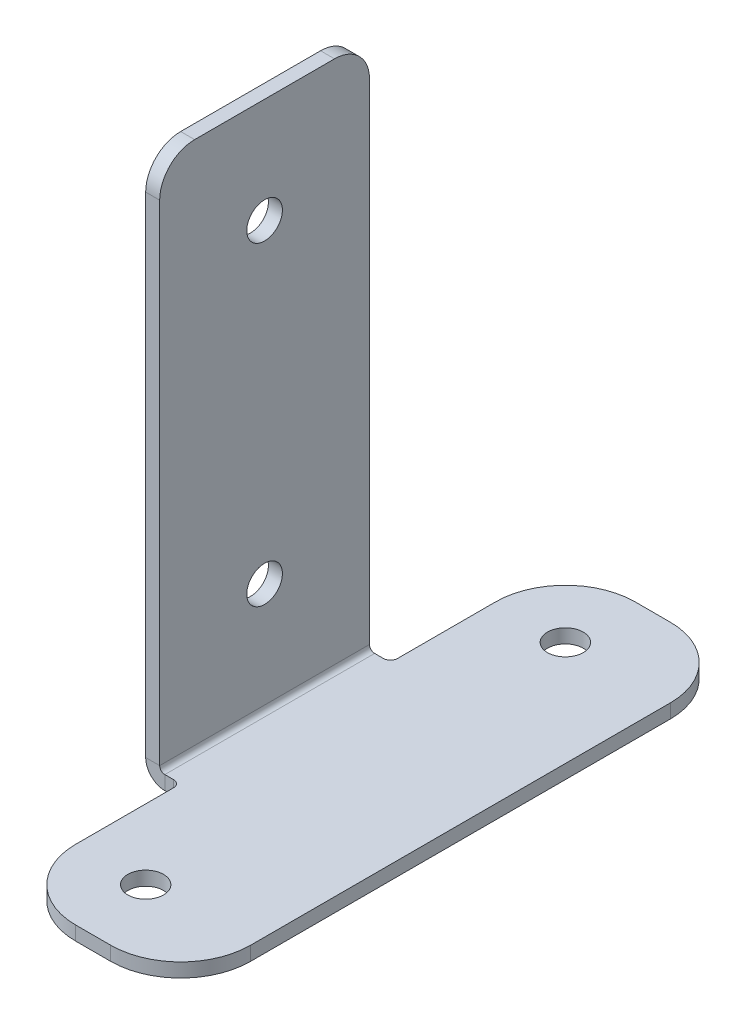
ISO-10303-21;
HEADER;
FILE_DESCRIPTION(('STEP AP214'),'2;1');
FILE_NAME('part.step','',(''),(''),'','','');
FILE_SCHEMA(('AUTOMOTIVE_DESIGN { 1 0 10303 214 1 1 1 1 }'));
ENDSEC;
DATA;
#1=APPLICATION_CONTEXT('core data for automotive mechanical design processes');
#2=APPLICATION_PROTOCOL_DEFINITION('international standard','automotive_design',2000,#1);
#3=PRODUCT_CONTEXT('',#1,'mechanical');
#4=PRODUCT('Part','Part','',(#3));
#5=PRODUCT_RELATED_PRODUCT_CATEGORY('part','',(#4));
#6=PRODUCT_DEFINITION_FORMATION('','',#4);
#7=PRODUCT_DEFINITION_CONTEXT('part definition',#1,'design');
#8=PRODUCT_DEFINITION('design','',#6,#7);
#9=PRODUCT_DEFINITION_SHAPE('','',#8);
#10=(LENGTH_UNIT() NAMED_UNIT(*) SI_UNIT(.MILLI.,.METRE.));
#11=(NAMED_UNIT(*) PLANE_ANGLE_UNIT() SI_UNIT($,.RADIAN.));
#12=(NAMED_UNIT(*) SI_UNIT($,.STERADIAN.) SOLID_ANGLE_UNIT());
#13=UNCERTAINTY_MEASURE_WITH_UNIT(LENGTH_MEASURE(1.E-05),#10,'distance_accuracy_value','');
#14=(GEOMETRIC_REPRESENTATION_CONTEXT(3) GLOBAL_UNCERTAINTY_ASSIGNED_CONTEXT((#13)) GLOBAL_UNIT_ASSIGNED_CONTEXT((#10,
#11,#12)) REPRESENTATION_CONTEXT('',''));
#15=CARTESIAN_POINT('',(0.,0.,0.));
#16=DIRECTION('',(0.,0.,1.));
#17=DIRECTION('',(1.,0.,0.));
#18=AXIS2_PLACEMENT_3D('',#15,#16,#17);
#19=CARTESIAN_POINT('',(-15.,-3.254644901112,15.));
#20=DIRECTION('',(0.,0.,1.));
#21=DIRECTION('',(0.,-1.,0.));
#22=AXIS2_PLACEMENT_3D('',#19,#20,#21);
#23=PLANE('',#22);
#24=DIRECTION('',(0.,-1.,0.));
#25=VECTOR('',#24,1.);
#26=CARTESIAN_POINT('',(-14.9999999999998,70.745355098888,15.));
#27=LINE('',#26,#25);
#28=CARTESIAN_POINT('',(-14.9999999999998,70.745355098888,15.));
#29=VERTEX_POINT('',#28);
#30=CARTESIAN_POINT('',(-15.,0.736600000000007,15.));
#31=VERTEX_POINT('',#30);
#32=EDGE_CURVE('E213',#29,#31,#27,.T.);
#33=ORIENTED_EDGE('',*,*,#32,.T.);
#34=DIRECTION('',(1.,0.,0.));
#35=VECTOR('',#34,1.);
#36=CARTESIAN_POINT('',(-15.,0.736600000000009,15.));
#37=LINE('',#36,#35);
#38=CARTESIAN_POINT('',(-13.,0.736600000000002,15.));
#39=VERTEX_POINT('',#38);
#40=EDGE_CURVE('E12',#31,#39,#37,.T.);
#41=ORIENTED_EDGE('',*,*,#40,.T.);
#42=DIRECTION('',(0.,-1.,0.));
#43=VECTOR('',#42,1.);
#44=CARTESIAN_POINT('',(-13.,-3.25464490111201,15.));
#45=LINE('',#44,#43);
#46=CARTESIAN_POINT('',(-12.9999999999998,70.745355098888,15.));
#47=VERTEX_POINT('',#46);
#48=EDGE_CURVE('E82',#47,#39,#45,.T.);
#49=ORIENTED_EDGE('',*,*,#48,.F.);
#50=DIRECTION('',(1.,0.,0.));
#51=VECTOR('',#50,1.);
#52=CARTESIAN_POINT('',(-14.9999999999998,70.745355098888,15.));
#53=LINE('',#52,#51);
#54=EDGE_CURVE('E63',#29,#47,#53,.T.);
#55=ORIENTED_EDGE('',*,*,#54,.F.);
#56=EDGE_LOOP('',(#33,#41,#49,#55));
#57=FACE_BOUND('',#56,.T.);
#58=ADVANCED_FACE('F38',(#57),#23,.T.);
#59=CARTESIAN_POINT('',(-15.,5.74535509888801,-15.));
#60=DIRECTION('',(0.,0.,-1.));
#61=DIRECTION('',(0.,1.,0.));
#62=AXIS2_PLACEMENT_3D('',#59,#60,#61);
#63=PLANE('',#62);
#64=DIRECTION('',(0.,1.,0.));
#65=VECTOR('',#64,1.);
#66=CARTESIAN_POINT('',(-13.,5.74535509888801,-15.));
#67=LINE('',#66,#65);
#68=CARTESIAN_POINT('',(-13.,0.736600000000003,-15.));
#69=VERTEX_POINT('',#68);
#70=CARTESIAN_POINT('',(-12.9999999999998,70.745355098888,-15.));
#71=VERTEX_POINT('',#70);
#72=EDGE_CURVE('E207',#69,#71,#67,.T.);
#73=ORIENTED_EDGE('',*,*,#72,.F.);
#74=DIRECTION('',(-1.,0.,0.));
#75=VECTOR('',#74,1.);
#76=CARTESIAN_POINT('',(-15.,0.736600000000009,-15.));
#77=LINE('',#76,#75);
#78=CARTESIAN_POINT('',(-15.,0.73660000000001,-15.));
#79=VERTEX_POINT('',#78);
#80=EDGE_CURVE('E189',#69,#79,#77,.T.);
#81=ORIENTED_EDGE('',*,*,#80,.T.);
#82=DIRECTION('',(0.,1.,0.));
#83=VECTOR('',#82,1.);
#84=CARTESIAN_POINT('',(-15.,5.74535509888801,-15.));
#85=LINE('',#84,#83);
#86=CARTESIAN_POINT('',(-14.9999999999998,70.745355098888,-15.));
#87=VERTEX_POINT('',#86);
#88=EDGE_CURVE('E41',#79,#87,#85,.T.);
#89=ORIENTED_EDGE('',*,*,#88,.T.);
#90=DIRECTION('',(1.,0.,0.));
#91=VECTOR('',#90,1.);
#92=CARTESIAN_POINT('',(-14.9999999999998,70.745355098888,-15.));
#93=LINE('',#92,#91);
#94=EDGE_CURVE('E215',#87,#71,#93,.T.);
#95=ORIENTED_EDGE('',*,*,#94,.T.);
#96=EDGE_LOOP('',(#73,#81,#89,#95));
#97=FACE_BOUND('',#96,.T.);
#98=ADVANCED_FACE('F206',(#97),#63,.T.);
#99=CARTESIAN_POINT('',(-15.,-14.254644901112,30.));
#100=DIRECTION('',(-1.,0.,0.));
#101=DIRECTION('',(0.,0.,-1.));
#102=AXIS2_PLACEMENT_3D('',#99,#100,#101);
#103=PLANE('',#102);
#104=CARTESIAN_POINT('',(-14.9999999999999,15.745355098888,0.));
#105=DIRECTION('',(1.,0.,0.));
#106=DIRECTION('',(0.,0.,1.));
#107=AXIS2_PLACEMENT_3D('',#104,#105,#106);
#108=CIRCLE('',#107,2.54999999999999);
#109=CARTESIAN_POINT('',(-14.9999999999999,15.745355098888,2.54999999999999));
#110=VERTEX_POINT('',#109);
#111=EDGE_CURVE('E230',#110,#110,#108,.T.);
#112=ORIENTED_EDGE('',*,*,#111,.T.);
#113=EDGE_LOOP('',(#112));
#114=FACE_BOUND('',#113,.T.);
#115=CARTESIAN_POINT('',(-14.9999999999998,60.745355098888,0.));
#116=DIRECTION('',(1.,0.,0.));
#117=DIRECTION('',(0.,0.,1.));
#118=AXIS2_PLACEMENT_3D('',#115,#116,#117);
#119=CIRCLE('',#118,2.54999999999999);
#120=CARTESIAN_POINT('',(-14.9999999999998,60.745355098888,2.54999999999999));
#121=VERTEX_POINT('',#120);
#122=EDGE_CURVE('E219',#121,#121,#119,.T.);
#123=ORIENTED_EDGE('',*,*,#122,.T.);
#124=EDGE_LOOP('',(#123));
#125=FACE_BOUND('',#124,.T.);
#126=ORIENTED_EDGE('',*,*,#88,.F.);
#127=DIRECTION('',(0.,0.,1.));
#128=VECTOR('',#127,1.);
#129=CARTESIAN_POINT('',(-15.,0.736600000000009,30.));
#130=LINE('',#129,#128);
#131=EDGE_CURVE('E184',#79,#31,#130,.T.);
#132=ORIENTED_EDGE('',*,*,#131,.T.);
#133=ORIENTED_EDGE('',*,*,#32,.F.);
#134=CARTESIAN_POINT('',(-14.9999999999998,70.745355098888,9.99999999999999));
#135=DIRECTION('',(1.,0.,0.));
#136=DIRECTION('',(0.,0.,1.));
#137=AXIS2_PLACEMENT_3D('',#134,#135,#136);
#138=CIRCLE('',#137,5.);
#139=CARTESIAN_POINT('',(-14.9999999999997,75.745355098888,9.99999999999999));
#140=VERTEX_POINT('',#139);
#141=EDGE_CURVE('E216',#140,#29,#138,.T.);
#142=ORIENTED_EDGE('',*,*,#141,.F.);
#143=DIRECTION('',(0.,0.,1.));
#144=VECTOR('',#143,1.);
#145=CARTESIAN_POINT('',(-14.9999999999997,75.745355098888,-9.99999999999999));
#146=LINE('',#145,#144);
#147=CARTESIAN_POINT('',(-14.9999999999997,75.745355098888,-9.99999999999999));
#148=VERTEX_POINT('',#147);
#149=EDGE_CURVE('E237',#148,#140,#146,.T.);
#150=ORIENTED_EDGE('',*,*,#149,.F.);
#151=CARTESIAN_POINT('',(-14.9999999999998,70.745355098888,-9.99999999999999));
#152=DIRECTION('',(1.,0.,0.));
#153=DIRECTION('',(0.,0.,1.));
#154=AXIS2_PLACEMENT_3D('',#151,#152,#153);
#155=CIRCLE('',#154,5.00000000000001);
#156=EDGE_CURVE('E204',#87,#148,#155,.T.);
#157=ORIENTED_EDGE('',*,*,#156,.F.);
#158=EDGE_LOOP('',(#126,#132,#133,#142,#150,#157));
#159=FACE_BOUND('',#158,.T.);
#160=ADVANCED_FACE('F201',(#114,#125,#159),#103,.T.);
#161=CARTESIAN_POINT('',(-14.9999999999998,70.745355098888,9.99999999999999));
#162=DIRECTION('',(1.,0.,0.));
#163=DIRECTION('',(0.,0.,1.));
#164=AXIS2_PLACEMENT_3D('',#161,#162,#163);
#165=CYLINDRICAL_SURFACE('',#164,5.);
#166=CARTESIAN_POINT('',(-12.9999999999998,70.745355098888,9.99999999999999));
#167=DIRECTION('',(1.,0.,0.));
#168=DIRECTION('',(0.,0.,1.));
#169=AXIS2_PLACEMENT_3D('',#166,#167,#168);
#170=CIRCLE('',#169,5.);
#171=CARTESIAN_POINT('',(-12.9999999999997,75.745355098888,9.99999999999999));
#172=VERTEX_POINT('',#171);
#173=EDGE_CURVE('E217',#172,#47,#170,.T.);
#174=ORIENTED_EDGE('',*,*,#173,.F.);
#175=DIRECTION('',(1.,0.,0.));
#176=VECTOR('',#175,1.);
#177=CARTESIAN_POINT('',(-14.9999999999997,75.745355098888,9.99999999999999));
#178=LINE('',#177,#176);
#179=EDGE_CURVE('E247',#140,#172,#178,.T.);
#180=ORIENTED_EDGE('',*,*,#179,.F.);
#181=ORIENTED_EDGE('',*,*,#141,.T.);
#182=ORIENTED_EDGE('',*,*,#54,.T.);
#183=EDGE_LOOP('',(#174,#180,#181,#182));
#184=FACE_BOUND('',#183,.T.);
#185=ADVANCED_FACE('F261',(#184),#165,.T.);
#186=CARTESIAN_POINT('',(-14.9999999999997,75.745355098888,-9.99999999999999));
#187=DIRECTION('',(0.,1.,0.));
#188=DIRECTION('',(0.,0.,1.));
#189=AXIS2_PLACEMENT_3D('',#186,#187,#188);
#190=PLANE('',#189);
#191=DIRECTION('',(0.,0.,1.));
#192=VECTOR('',#191,1.);
#193=CARTESIAN_POINT('',(-12.9999999999997,75.745355098888,-9.99999999999999));
#194=LINE('',#193,#192);
#195=CARTESIAN_POINT('',(-12.9999999999997,75.745355098888,-9.99999999999999));
#196=VERTEX_POINT('',#195);
#197=EDGE_CURVE('E222',#196,#172,#194,.T.);
#198=ORIENTED_EDGE('',*,*,#197,.F.);
#199=DIRECTION('',(1.,0.,0.));
#200=VECTOR('',#199,1.);
#201=CARTESIAN_POINT('',(-14.9999999999997,75.745355098888,-9.99999999999999));
#202=LINE('',#201,#200);
#203=EDGE_CURVE('E249',#148,#196,#202,.T.);
#204=ORIENTED_EDGE('',*,*,#203,.F.);
#205=ORIENTED_EDGE('',*,*,#149,.T.);
#206=ORIENTED_EDGE('',*,*,#179,.T.);
#207=EDGE_LOOP('',(#198,#204,#205,#206));
#208=FACE_BOUND('',#207,.T.);
#209=ADVANCED_FACE('F258',(#208),#190,.T.);
#210=CARTESIAN_POINT('',(-14.9999999999998,70.745355098888,-9.99999999999999));
#211=DIRECTION('',(1.,0.,0.));
#212=DIRECTION('',(0.,0.,1.));
#213=AXIS2_PLACEMENT_3D('',#210,#211,#212);
#214=CYLINDRICAL_SURFACE('',#213,5.00000000000001);
#215=CARTESIAN_POINT('',(-12.9999999999998,70.745355098888,-9.99999999999999));
#216=DIRECTION('',(1.,0.,0.));
#217=DIRECTION('',(0.,0.,1.));
#218=AXIS2_PLACEMENT_3D('',#215,#216,#217);
#219=CIRCLE('',#218,5.00000000000001);
#220=EDGE_CURVE('E218',#71,#196,#219,.T.);
#221=ORIENTED_EDGE('',*,*,#220,.F.);
#222=ORIENTED_EDGE('',*,*,#94,.F.);
#223=ORIENTED_EDGE('',*,*,#156,.T.);
#224=ORIENTED_EDGE('',*,*,#203,.T.);
#225=EDGE_LOOP('',(#221,#222,#223,#224));
#226=FACE_BOUND('',#225,.T.);
#227=ADVANCED_FACE('F252',(#226),#214,.T.);
#228=CARTESIAN_POINT('',(-13.,-14.254644901112,30.));
#229=DIRECTION('',(-1.,0.,0.));
#230=DIRECTION('',(0.,0.,-1.));
#231=AXIS2_PLACEMENT_3D('',#228,#229,#230);
#232=PLANE('',#231);
#233=DIRECTION('',(0.,0.,1.));
#234=VECTOR('',#233,1.);
#235=CARTESIAN_POINT('',(-13.,0.736600000000002,30.));
#236=LINE('',#235,#234);
#237=EDGE_CURVE('E46',#69,#39,#236,.T.);
#238=ORIENTED_EDGE('',*,*,#237,.F.);
#239=ORIENTED_EDGE('',*,*,#72,.T.);
#240=ORIENTED_EDGE('',*,*,#220,.T.);
#241=ORIENTED_EDGE('',*,*,#197,.T.);
#242=ORIENTED_EDGE('',*,*,#173,.T.);
#243=ORIENTED_EDGE('',*,*,#48,.T.);
#244=EDGE_LOOP('',(#238,#239,#240,#241,#242,#243));
#245=FACE_BOUND('',#244,.T.);
#246=CARTESIAN_POINT('',(-12.9999999999999,15.745355098888,0.));
#247=DIRECTION('',(1.,0.,0.));
#248=DIRECTION('',(0.,0.,1.));
#249=AXIS2_PLACEMENT_3D('',#246,#247,#248);
#250=CIRCLE('',#249,2.54999999999999);
#251=CARTESIAN_POINT('',(-12.9999999999999,15.745355098888,2.54999999999999));
#252=VERTEX_POINT('',#251);
#253=EDGE_CURVE('E233',#252,#252,#250,.T.);
#254=ORIENTED_EDGE('',*,*,#253,.F.);
#255=EDGE_LOOP('',(#254));
#256=FACE_BOUND('',#255,.T.);
#257=CARTESIAN_POINT('',(-12.9999999999998,60.745355098888,0.));
#258=DIRECTION('',(1.,0.,0.));
#259=DIRECTION('',(0.,0.,1.));
#260=AXIS2_PLACEMENT_3D('',#257,#258,#259);
#261=CIRCLE('',#260,2.54999999999999);
#262=CARTESIAN_POINT('',(-12.9999999999998,60.745355098888,2.54999999999999));
#263=VERTEX_POINT('',#262);
#264=EDGE_CURVE('E225',#263,#263,#261,.T.);
#265=ORIENTED_EDGE('',*,*,#264,.F.);
#266=EDGE_LOOP('',(#265));
#267=FACE_BOUND('',#266,.T.);
#268=ADVANCED_FACE('F254',(#245,#256,#267),#232,.F.);
#269=CARTESIAN_POINT('',(-14.9999999999998,60.745355098888,0.));
#270=DIRECTION('',(1.,0.,0.));
#271=DIRECTION('',(0.,0.,1.));
#272=AXIS2_PLACEMENT_3D('',#269,#270,#271);
#273=CYLINDRICAL_SURFACE('',#272,2.54999999999999);
#274=ORIENTED_EDGE('',*,*,#122,.F.);
#275=EDGE_LOOP('',(#274));
#276=FACE_BOUND('',#275,.T.);
#277=ORIENTED_EDGE('',*,*,#264,.T.);
#278=EDGE_LOOP('',(#277));
#279=FACE_BOUND('',#278,.T.);
#280=ADVANCED_FACE('F404',(#276,#279),#273,.F.);
#281=CARTESIAN_POINT('',(-14.9999999999999,15.745355098888,0.));
#282=DIRECTION('',(1.,0.,0.));
#283=DIRECTION('',(0.,0.,1.));
#284=AXIS2_PLACEMENT_3D('',#281,#282,#283);
#285=CYLINDRICAL_SURFACE('',#284,2.54999999999999);
#286=ORIENTED_EDGE('',*,*,#111,.F.);
#287=EDGE_LOOP('',(#286));
#288=FACE_BOUND('',#287,.T.);
#289=ORIENTED_EDGE('',*,*,#253,.T.);
#290=EDGE_LOOP('',(#289));
#291=FACE_BOUND('',#290,.T.);
#292=ADVANCED_FACE('F401',(#288,#291),#285,.F.);
#293=CARTESIAN_POINT('',(0.,-2.,30.));
#294=DIRECTION('',(0.,1.,0.));
#295=DIRECTION('',(0.,0.,1.));
#296=AXIS2_PLACEMENT_3D('',#293,#294,#295);
#297=CYLINDRICAL_SURFACE('',#296,2.55);
#298=CARTESIAN_POINT('',(0.,-2.,30.));
#299=DIRECTION('',(0.,1.,0.));
#300=DIRECTION('',(0.,0.,-1.));
#301=AXIS2_PLACEMENT_3D('',#298,#299,#300);
#302=CIRCLE('',#301,2.55);
#303=CARTESIAN_POINT('',(0.,-2.,27.45));
#304=VERTEX_POINT('',#303);
#305=EDGE_CURVE('E324',#304,#304,#302,.T.);
#306=ORIENTED_EDGE('',*,*,#305,.F.);
#307=EDGE_LOOP('',(#306));
#308=FACE_BOUND('',#307,.T.);
#309=CARTESIAN_POINT('',(0.,0.,30.));
#310=DIRECTION('',(0.,1.,0.));
#311=DIRECTION('',(0.,0.,-1.));
#312=AXIS2_PLACEMENT_3D('',#309,#310,#311);
#313=CIRCLE('',#312,2.55);
#314=CARTESIAN_POINT('',(0.,0.,27.45));
#315=VERTEX_POINT('',#314);
#316=EDGE_CURVE('E389',#315,#315,#313,.T.);
#317=ORIENTED_EDGE('',*,*,#316,.T.);
#318=EDGE_LOOP('',(#317));
#319=FACE_BOUND('',#318,.T.);
#320=ADVANCED_FACE('F413',(#308,#319),#297,.F.);
#321=CARTESIAN_POINT('',(0.,-2.,-30.));
#322=DIRECTION('',(0.,1.,0.));
#323=DIRECTION('',(0.,0.,1.));
#324=AXIS2_PLACEMENT_3D('',#321,#322,#323);
#325=CYLINDRICAL_SURFACE('',#324,2.55);
#326=CARTESIAN_POINT('',(0.,-2.,-30.));
#327=DIRECTION('',(0.,1.,0.));
#328=DIRECTION('',(0.,0.,1.));
#329=AXIS2_PLACEMENT_3D('',#326,#327,#328);
#330=CIRCLE('',#329,2.55);
#331=CARTESIAN_POINT('',(0.,-2.,-27.45));
#332=VERTEX_POINT('',#331);
#333=EDGE_CURVE('E327',#332,#332,#330,.T.);
#334=ORIENTED_EDGE('',*,*,#333,.F.);
#335=EDGE_LOOP('',(#334));
#336=FACE_BOUND('',#335,.T.);
#337=CARTESIAN_POINT('',(0.,0.,-30.));
#338=DIRECTION('',(0.,1.,0.));
#339=DIRECTION('',(0.,0.,1.));
#340=AXIS2_PLACEMENT_3D('',#337,#338,#339);
#341=CIRCLE('',#340,2.55);
#342=CARTESIAN_POINT('',(0.,0.,-27.45));
#343=VERTEX_POINT('',#342);
#344=EDGE_CURVE('E386',#343,#343,#341,.T.);
#345=ORIENTED_EDGE('',*,*,#344,.T.);
#346=EDGE_LOOP('',(#345));
#347=FACE_BOUND('',#346,.T.);
#348=ADVANCED_FACE('F472',(#336,#347),#325,.F.);
#349=CARTESIAN_POINT('',(-11.,-2.,16.));
#350=DIRECTION('',(0.,1.,0.));
#351=DIRECTION('',(0.,0.,1.));
#352=AXIS2_PLACEMENT_3D('',#349,#350,#351);
#353=CYLINDRICAL_SURFACE('',#352,1.);
#354=CARTESIAN_POINT('',(-11.,0.,16.));
#355=DIRECTION('',(0.,-1.,0.));
#356=DIRECTION('',(0.,0.,-1.));
#357=AXIS2_PLACEMENT_3D('',#354,#355,#356);
#358=CIRCLE('',#357,1.);
#359=CARTESIAN_POINT('',(-11.,0.,15.));
#360=VERTEX_POINT('',#359);
#361=CARTESIAN_POINT('',(-10.,0.,16.));
#362=VERTEX_POINT('',#361);
#363=EDGE_CURVE('E314',#360,#362,#358,.T.);
#364=ORIENTED_EDGE('',*,*,#363,.F.);
#365=DIRECTION('',(0.,1.,0.));
#366=VECTOR('',#365,1.);
#367=CARTESIAN_POINT('',(-11.,-2.,15.));
#368=LINE('',#367,#366);
#369=CARTESIAN_POINT('',(-11.,-2.,15.));
#370=VERTEX_POINT('',#369);
#371=EDGE_CURVE('E279',#370,#360,#368,.T.);
#372=ORIENTED_EDGE('',*,*,#371,.F.);
#373=CARTESIAN_POINT('',(-11.,-2.,16.));
#374=DIRECTION('',(0.,-1.,0.));
#375=DIRECTION('',(0.,0.,-1.));
#376=AXIS2_PLACEMENT_3D('',#373,#374,#375);
#377=CIRCLE('',#376,1.);
#378=CARTESIAN_POINT('',(-10.,-2.,16.));
#379=VERTEX_POINT('',#378);
#380=EDGE_CURVE('E383',#370,#379,#377,.T.);
#381=ORIENTED_EDGE('',*,*,#380,.T.);
#382=DIRECTION('',(0.,1.,0.));
#383=VECTOR('',#382,1.);
#384=CARTESIAN_POINT('',(-10.,-2.,16.));
#385=LINE('',#384,#383);
#386=EDGE_CURVE('E381',#379,#362,#385,.T.);
#387=ORIENTED_EDGE('',*,*,#386,.T.);
#388=EDGE_LOOP('',(#364,#372,#381,#387));
#389=FACE_BOUND('',#388,.T.);
#390=ADVANCED_FACE('F484',(#389),#353,.F.);
#391=CARTESIAN_POINT('',(-10.,-2.,16.));
#392=DIRECTION('',(-1.,0.,0.));
#393=DIRECTION('',(0.,0.,1.));
#394=AXIS2_PLACEMENT_3D('',#391,#392,#393);
#395=PLANE('',#394);
#396=DIRECTION('',(0.,0.,1.));
#397=VECTOR('',#396,1.);
#398=CARTESIAN_POINT('',(-10.,0.,16.));
#399=LINE('',#398,#397);
#400=CARTESIAN_POINT('',(-10.,0.,30.));
#401=VERTEX_POINT('',#400);
#402=EDGE_CURVE('E311',#362,#401,#399,.T.);
#403=ORIENTED_EDGE('',*,*,#402,.F.);
#404=ORIENTED_EDGE('',*,*,#386,.F.);
#405=DIRECTION('',(0.,0.,1.));
#406=VECTOR('',#405,1.);
#407=CARTESIAN_POINT('',(-10.,-2.,16.));
#408=LINE('',#407,#406);
#409=CARTESIAN_POINT('',(-10.,-2.,30.));
#410=VERTEX_POINT('',#409);
#411=EDGE_CURVE('E378',#379,#410,#408,.T.);
#412=ORIENTED_EDGE('',*,*,#411,.T.);
#413=DIRECTION('',(0.,1.,0.));
#414=VECTOR('',#413,1.);
#415=CARTESIAN_POINT('',(-10.,-2.,30.));
#416=LINE('',#415,#414);
#417=EDGE_CURVE('E376',#410,#401,#416,.T.);
#418=ORIENTED_EDGE('',*,*,#417,.T.);
#419=EDGE_LOOP('',(#403,#404,#412,#418));
#420=FACE_BOUND('',#419,.T.);
#421=ADVANCED_FACE('F495',(#420),#395,.T.);
#422=CARTESIAN_POINT('',(0.,-2.,30.));
#423=DIRECTION('',(0.,1.,0.));
#424=DIRECTION('',(0.,0.,1.));
#425=AXIS2_PLACEMENT_3D('',#422,#423,#424);
#426=CYLINDRICAL_SURFACE('',#425,10.);
#427=CARTESIAN_POINT('',(0.,0.,30.));
#428=DIRECTION('',(0.,1.,0.));
#429=DIRECTION('',(0.,0.,-1.));
#430=AXIS2_PLACEMENT_3D('',#427,#428,#429);
#431=CIRCLE('',#430,10.);
#432=CARTESIAN_POINT('',(0.,0.,40.));
#433=VERTEX_POINT('',#432);
#434=EDGE_CURVE('E308',#401,#433,#431,.T.);
#435=ORIENTED_EDGE('',*,*,#434,.F.);
#436=ORIENTED_EDGE('',*,*,#417,.F.);
#437=CARTESIAN_POINT('',(0.,-2.,30.));
#438=DIRECTION('',(0.,1.,0.));
#439=DIRECTION('',(0.,0.,-1.));
#440=AXIS2_PLACEMENT_3D('',#437,#438,#439);
#441=CIRCLE('',#440,10.);
#442=CARTESIAN_POINT('',(0.,-2.,40.));
#443=VERTEX_POINT('',#442);
#444=EDGE_CURVE('E373',#410,#443,#441,.T.);
#445=ORIENTED_EDGE('',*,*,#444,.T.);
#446=DIRECTION('',(0.,1.,0.));
#447=VECTOR('',#446,1.);
#448=CARTESIAN_POINT('',(0.,-2.,40.));
#449=LINE('',#448,#447);
#450=EDGE_CURVE('E371',#443,#433,#449,.T.);
#451=ORIENTED_EDGE('',*,*,#450,.T.);
#452=EDGE_LOOP('',(#435,#436,#445,#451));
#453=FACE_BOUND('',#452,.T.);
#454=ADVANCED_FACE('F506',(#453),#426,.T.);
#455=CARTESIAN_POINT('',(0.,-2.,40.));
#456=DIRECTION('',(0.,0.,1.));
#457=DIRECTION('',(1.,0.,0.));
#458=AXIS2_PLACEMENT_3D('',#455,#456,#457);
#459=PLANE('',#458);
#460=DIRECTION('',(1.,0.,0.));
#461=VECTOR('',#460,1.);
#462=CARTESIAN_POINT('',(0.,0.,40.));
#463=LINE('',#462,#461);
#464=CARTESIAN_POINT('',(5.,0.,40.));
#465=VERTEX_POINT('',#464);
#466=EDGE_CURVE('E305',#433,#465,#463,.T.);
#467=ORIENTED_EDGE('',*,*,#466,.F.);
#468=ORIENTED_EDGE('',*,*,#450,.F.);
#469=DIRECTION('',(1.,0.,0.));
#470=VECTOR('',#469,1.);
#471=CARTESIAN_POINT('',(0.,-2.,40.));
#472=LINE('',#471,#470);
#473=CARTESIAN_POINT('',(5.,-2.,40.));
#474=VERTEX_POINT('',#473);
#475=EDGE_CURVE('E368',#443,#474,#472,.T.);
#476=ORIENTED_EDGE('',*,*,#475,.T.);
#477=DIRECTION('',(0.,1.,0.));
#478=VECTOR('',#477,1.);
#479=CARTESIAN_POINT('',(5.,-2.,40.));
#480=LINE('',#479,#478);
#481=EDGE_CURVE('E366',#474,#465,#480,.T.);
#482=ORIENTED_EDGE('',*,*,#481,.T.);
#483=EDGE_LOOP('',(#467,#468,#476,#482));
#484=FACE_BOUND('',#483,.T.);
#485=ADVANCED_FACE('F517',(#484),#459,.T.);
#486=CARTESIAN_POINT('',(5.,-2.,30.));
#487=DIRECTION('',(0.,1.,0.));
#488=DIRECTION('',(0.,0.,1.));
#489=AXIS2_PLACEMENT_3D('',#486,#487,#488);
#490=CYLINDRICAL_SURFACE('',#489,10.);
#491=CARTESIAN_POINT('',(5.,0.,30.));
#492=DIRECTION('',(0.,1.,0.));
#493=DIRECTION('',(0.,0.,1.));
#494=AXIS2_PLACEMENT_3D('',#491,#492,#493);
#495=CIRCLE('',#494,10.);
#496=CARTESIAN_POINT('',(15.,0.,30.));
#497=VERTEX_POINT('',#496);
#498=EDGE_CURVE('E302',#465,#497,#495,.T.);
#499=ORIENTED_EDGE('',*,*,#498,.F.);
#500=ORIENTED_EDGE('',*,*,#481,.F.);
#501=CARTESIAN_POINT('',(5.,-2.,30.));
#502=DIRECTION('',(0.,1.,0.));
#503=DIRECTION('',(0.,0.,1.));
#504=AXIS2_PLACEMENT_3D('',#501,#502,#503);
#505=CIRCLE('',#504,10.);
#506=CARTESIAN_POINT('',(15.,-2.,30.));
#507=VERTEX_POINT('',#506);
#508=EDGE_CURVE('E363',#474,#507,#505,.T.);
#509=ORIENTED_EDGE('',*,*,#508,.T.);
#510=DIRECTION('',(0.,1.,0.));
#511=VECTOR('',#510,1.);
#512=CARTESIAN_POINT('',(15.,-2.,30.));
#513=LINE('',#512,#511);
#514=EDGE_CURVE('E360',#507,#497,#513,.T.);
#515=ORIENTED_EDGE('',*,*,#514,.T.);
#516=EDGE_LOOP('',(#499,#500,#509,#515));
#517=FACE_BOUND('',#516,.T.);
#518=ADVANCED_FACE('F528',(#517),#490,.T.);
#519=CARTESIAN_POINT('',(15.,-2.,-30.));
#520=DIRECTION('',(1.,0.,0.));
#521=DIRECTION('',(0.,0.,-1.));
#522=AXIS2_PLACEMENT_3D('',#519,#520,#521);
#523=PLANE('',#522);
#524=DIRECTION('',(0.,0.,-1.));
#525=VECTOR('',#524,1.);
#526=CARTESIAN_POINT('',(15.,0.,-30.));
#527=LINE('',#526,#525);
#528=CARTESIAN_POINT('',(15.,0.,-30.));
#529=VERTEX_POINT('',#528);
#530=EDGE_CURVE('E299',#497,#529,#527,.T.);
#531=ORIENTED_EDGE('',*,*,#530,.F.);
#532=ORIENTED_EDGE('',*,*,#514,.F.);
#533=DIRECTION('',(0.,0.,-1.));
#534=VECTOR('',#533,1.);
#535=CARTESIAN_POINT('',(15.,-2.,30.));
#536=LINE('',#535,#534);
#537=CARTESIAN_POINT('',(15.,-2.,-30.));
#538=VERTEX_POINT('',#537);
#539=EDGE_CURVE('E358',#507,#538,#536,.T.);
#540=ORIENTED_EDGE('',*,*,#539,.T.);
#541=DIRECTION('',(0.,1.,0.));
#542=VECTOR('',#541,1.);
#543=CARTESIAN_POINT('',(15.,-2.,-30.));
#544=LINE('',#543,#542);
#545=EDGE_CURVE('E356',#538,#529,#544,.T.);
#546=ORIENTED_EDGE('',*,*,#545,.T.);
#547=EDGE_LOOP('',(#531,#532,#540,#546));
#548=FACE_BOUND('',#547,.T.);
#549=ADVANCED_FACE('F539',(#548),#523,.T.);
#550=CARTESIAN_POINT('',(5.,-2.,-30.));
#551=DIRECTION('',(0.,1.,0.));
#552=DIRECTION('',(0.,0.,1.));
#553=AXIS2_PLACEMENT_3D('',#550,#551,#552);
#554=CYLINDRICAL_SURFACE('',#553,10.);
#555=CARTESIAN_POINT('',(5.,0.,-30.));
#556=DIRECTION('',(0.,1.,0.));
#557=DIRECTION('',(0.,0.,-1.));
#558=AXIS2_PLACEMENT_3D('',#555,#556,#557);
#559=CIRCLE('',#558,10.);
#560=CARTESIAN_POINT('',(5.,0.,-40.));
#561=VERTEX_POINT('',#560);
#562=EDGE_CURVE('E296',#529,#561,#559,.T.);
#563=ORIENTED_EDGE('',*,*,#562,.F.);
#564=ORIENTED_EDGE('',*,*,#545,.F.);
#565=CARTESIAN_POINT('',(5.,-2.,-30.));
#566=DIRECTION('',(0.,1.,0.));
#567=DIRECTION('',(0.,0.,-1.));
#568=AXIS2_PLACEMENT_3D('',#565,#566,#567);
#569=CIRCLE('',#568,10.);
#570=CARTESIAN_POINT('',(5.,-2.,-40.));
#571=VERTEX_POINT('',#570);
#572=EDGE_CURVE('E353',#538,#571,#569,.T.);
#573=ORIENTED_EDGE('',*,*,#572,.T.);
#574=DIRECTION('',(0.,1.,0.));
#575=VECTOR('',#574,1.);
#576=CARTESIAN_POINT('',(5.,-2.,-40.));
#577=LINE('',#576,#575);
#578=EDGE_CURVE('E351',#571,#561,#577,.T.);
#579=ORIENTED_EDGE('',*,*,#578,.T.);
#580=EDGE_LOOP('',(#563,#564,#573,#579));
#581=FACE_BOUND('',#580,.T.);
#582=ADVANCED_FACE('F550',(#581),#554,.T.);
#583=CARTESIAN_POINT('',(0.,-2.,-40.));
#584=DIRECTION('',(0.,0.,-1.));
#585=DIRECTION('',(-1.,0.,0.));
#586=AXIS2_PLACEMENT_3D('',#583,#584,#585);
#587=PLANE('',#586);
#588=DIRECTION('',(-1.,0.,0.));
#589=VECTOR('',#588,1.);
#590=CARTESIAN_POINT('',(0.,0.,-40.));
#591=LINE('',#590,#589);
#592=CARTESIAN_POINT('',(0.,0.,-40.));
#593=VERTEX_POINT('',#592);
#594=EDGE_CURVE('E293',#561,#593,#591,.T.);
#595=ORIENTED_EDGE('',*,*,#594,.F.);
#596=ORIENTED_EDGE('',*,*,#578,.F.);
#597=DIRECTION('',(-1.,0.,0.));
#598=VECTOR('',#597,1.);
#599=CARTESIAN_POINT('',(0.,-2.,-40.));
#600=LINE('',#599,#598);
#601=CARTESIAN_POINT('',(0.,-2.,-40.));
#602=VERTEX_POINT('',#601);
#603=EDGE_CURVE('E348',#571,#602,#600,.T.);
#604=ORIENTED_EDGE('',*,*,#603,.T.);
#605=DIRECTION('',(0.,1.,0.));
#606=VECTOR('',#605,1.);
#607=CARTESIAN_POINT('',(0.,-2.,-40.));
#608=LINE('',#607,#606);
#609=EDGE_CURVE('E346',#602,#593,#608,.T.);
#610=ORIENTED_EDGE('',*,*,#609,.T.);
#611=EDGE_LOOP('',(#595,#596,#604,#610));
#612=FACE_BOUND('',#611,.T.);
#613=ADVANCED_FACE('F561',(#612),#587,.T.);
#614=CARTESIAN_POINT('',(0.,-2.,-30.));
#615=DIRECTION('',(0.,1.,0.));
#616=DIRECTION('',(0.,0.,1.));
#617=AXIS2_PLACEMENT_3D('',#614,#615,#616);
#618=CYLINDRICAL_SURFACE('',#617,10.);
#619=CARTESIAN_POINT('',(0.,0.,-30.));
#620=DIRECTION('',(0.,1.,0.));
#621=DIRECTION('',(0.,0.,1.));
#622=AXIS2_PLACEMENT_3D('',#619,#620,#621);
#623=CIRCLE('',#622,10.);
#624=CARTESIAN_POINT('',(-10.,0.,-30.));
#625=VERTEX_POINT('',#624);
#626=EDGE_CURVE('E290',#593,#625,#623,.T.);
#627=ORIENTED_EDGE('',*,*,#626,.F.);
#628=ORIENTED_EDGE('',*,*,#609,.F.);
#629=CARTESIAN_POINT('',(0.,-2.,-30.));
#630=DIRECTION('',(0.,1.,0.));
#631=DIRECTION('',(0.,0.,1.));
#632=AXIS2_PLACEMENT_3D('',#629,#630,#631);
#633=CIRCLE('',#632,10.);
#634=CARTESIAN_POINT('',(-10.,-2.,-30.));
#635=VERTEX_POINT('',#634);
#636=EDGE_CURVE('E343',#602,#635,#633,.T.);
#637=ORIENTED_EDGE('',*,*,#636,.T.);
#638=DIRECTION('',(0.,1.,0.));
#639=VECTOR('',#638,1.);
#640=CARTESIAN_POINT('',(-10.,-2.,-30.));
#641=LINE('',#640,#639);
#642=EDGE_CURVE('E341',#635,#625,#641,.T.);
#643=ORIENTED_EDGE('',*,*,#642,.T.);
#644=EDGE_LOOP('',(#627,#628,#637,#643));
#645=FACE_BOUND('',#644,.T.);
#646=ADVANCED_FACE('F572',(#645),#618,.T.);
#647=CARTESIAN_POINT('',(-10.,-2.,-16.));
#648=DIRECTION('',(-1.,0.,0.));
#649=DIRECTION('',(0.,0.,1.));
#650=AXIS2_PLACEMENT_3D('',#647,#648,#649);
#651=PLANE('',#650);
#652=DIRECTION('',(0.,0.,1.));
#653=VECTOR('',#652,1.);
#654=CARTESIAN_POINT('',(-10.,0.,-16.));
#655=LINE('',#654,#653);
#656=CARTESIAN_POINT('',(-10.,0.,-16.));
#657=VERTEX_POINT('',#656);
#658=EDGE_CURVE('E287',#625,#657,#655,.T.);
#659=ORIENTED_EDGE('',*,*,#658,.F.);
#660=ORIENTED_EDGE('',*,*,#642,.F.);
#661=DIRECTION('',(0.,0.,1.));
#662=VECTOR('',#661,1.);
#663=CARTESIAN_POINT('',(-10.,-2.,-16.));
#664=LINE('',#663,#662);
#665=CARTESIAN_POINT('',(-10.,-2.,-16.));
#666=VERTEX_POINT('',#665);
#667=EDGE_CURVE('E338',#635,#666,#664,.T.);
#668=ORIENTED_EDGE('',*,*,#667,.T.);
#669=DIRECTION('',(0.,1.,0.));
#670=VECTOR('',#669,1.);
#671=CARTESIAN_POINT('',(-10.,-2.,-16.));
#672=LINE('',#671,#670);
#673=EDGE_CURVE('E336',#666,#657,#672,.T.);
#674=ORIENTED_EDGE('',*,*,#673,.T.);
#675=EDGE_LOOP('',(#659,#660,#668,#674));
#676=FACE_BOUND('',#675,.T.);
#677=ADVANCED_FACE('F583',(#676),#651,.T.);
#678=CARTESIAN_POINT('',(-11.,-2.,-16.));
#679=DIRECTION('',(0.,1.,0.));
#680=DIRECTION('',(0.,0.,1.));
#681=AXIS2_PLACEMENT_3D('',#678,#679,#680);
#682=CYLINDRICAL_SURFACE('',#681,1.);
#683=CARTESIAN_POINT('',(-11.,0.,-16.));
#684=DIRECTION('',(0.,-1.,0.));
#685=DIRECTION('',(0.,0.,1.));
#686=AXIS2_PLACEMENT_3D('',#683,#684,#685);
#687=CIRCLE('',#686,1.);
#688=CARTESIAN_POINT('',(-11.,0.,-15.));
#689=VERTEX_POINT('',#688);
#690=EDGE_CURVE('E284',#657,#689,#687,.T.);
#691=ORIENTED_EDGE('',*,*,#690,.F.);
#692=ORIENTED_EDGE('',*,*,#673,.F.);
#693=CARTESIAN_POINT('',(-11.,-2.,-16.));
#694=DIRECTION('',(0.,-1.,0.));
#695=DIRECTION('',(0.,0.,1.));
#696=AXIS2_PLACEMENT_3D('',#693,#694,#695);
#697=CIRCLE('',#696,1.);
#698=CARTESIAN_POINT('',(-11.,-2.,-15.));
#699=VERTEX_POINT('',#698);
#700=EDGE_CURVE('E333',#666,#699,#697,.T.);
#701=ORIENTED_EDGE('',*,*,#700,.T.);
#702=DIRECTION('',(0.,1.,0.));
#703=VECTOR('',#702,1.);
#704=CARTESIAN_POINT('',(-11.,-2.,-15.));
#705=LINE('',#704,#703);
#706=EDGE_CURVE('E330',#699,#689,#705,.T.);
#707=ORIENTED_EDGE('',*,*,#706,.T.);
#708=EDGE_LOOP('',(#691,#692,#701,#707));
#709=FACE_BOUND('',#708,.T.);
#710=ADVANCED_FACE('F594',(#709),#682,.F.);
#711=CARTESIAN_POINT('',(0.,-2.,30.));
#712=DIRECTION('',(0.,-1.,0.));
#713=DIRECTION('',(0.,0.,-1.));
#714=AXIS2_PLACEMENT_3D('',#711,#712,#713);
#715=PLANE('',#714);
#716=DIRECTION('',(0.,0.,1.));
#717=VECTOR('',#716,1.);
#718=CARTESIAN_POINT('',(-12.2634,-2.,30.));
#719=LINE('',#718,#717);
#720=CARTESIAN_POINT('',(-12.2634,-2.,-15.));
#721=VERTEX_POINT('',#720);
#722=CARTESIAN_POINT('',(-12.2634,-2.,15.));
#723=VERTEX_POINT('',#722);
#724=EDGE_CURVE('E394',#721,#723,#719,.T.);
#725=ORIENTED_EDGE('',*,*,#724,.F.);
#726=DIRECTION('',(-1.,0.,0.));
#727=VECTOR('',#726,1.);
#728=CARTESIAN_POINT('',(-20.,-2.,-15.));
#729=LINE('',#728,#727);
#730=EDGE_CURVE('E322',#699,#721,#729,.T.);
#731=ORIENTED_EDGE('',*,*,#730,.F.);
#732=ORIENTED_EDGE('',*,*,#700,.F.);
#733=ORIENTED_EDGE('',*,*,#667,.F.);
#734=ORIENTED_EDGE('',*,*,#636,.F.);
#735=ORIENTED_EDGE('',*,*,#603,.F.);
#736=ORIENTED_EDGE('',*,*,#572,.F.);
#737=ORIENTED_EDGE('',*,*,#539,.F.);
#738=ORIENTED_EDGE('',*,*,#508,.F.);
#739=ORIENTED_EDGE('',*,*,#475,.F.);
#740=ORIENTED_EDGE('',*,*,#444,.F.);
#741=ORIENTED_EDGE('',*,*,#411,.F.);
#742=ORIENTED_EDGE('',*,*,#380,.F.);
#743=DIRECTION('',(1.,0.,0.));
#744=VECTOR('',#743,1.);
#745=CARTESIAN_POINT('',(-85.,-2.,15.));
#746=LINE('',#745,#744);
#747=EDGE_CURVE('E282',#723,#370,#746,.T.);
#748=ORIENTED_EDGE('',*,*,#747,.F.);
#749=EDGE_LOOP('',(#725,#731,#732,#733,#734,#735,#736,#737,#738,#739,#740,#741,#742,#748));
#750=FACE_BOUND('',#749,.T.);
#751=ORIENTED_EDGE('',*,*,#333,.T.);
#752=EDGE_LOOP('',(#751));
#753=FACE_BOUND('',#752,.T.);
#754=ORIENTED_EDGE('',*,*,#305,.T.);
#755=EDGE_LOOP('',(#754));
#756=FACE_BOUND('',#755,.T.);
#757=ADVANCED_FACE('F605',(#750,#753,#756),#715,.T.);
#758=CARTESIAN_POINT('',(-20.,-2.,-15.));
#759=DIRECTION('',(0.,0.,-1.));
#760=DIRECTION('',(-1.,0.,0.));
#761=AXIS2_PLACEMENT_3D('',#758,#759,#760);
#762=PLANE('',#761);
#763=DIRECTION('',(0.,-1.,0.));
#764=VECTOR('',#763,1.);
#765=CARTESIAN_POINT('',(-12.2634,-2.,-15.));
#766=LINE('',#765,#764);
#767=CARTESIAN_POINT('',(-12.2634,0.,-15.));
#768=VERTEX_POINT('',#767);
#769=EDGE_CURVE('E197',#768,#721,#766,.T.);
#770=ORIENTED_EDGE('',*,*,#769,.F.);
#771=DIRECTION('',(-1.,0.,0.));
#772=VECTOR('',#771,1.);
#773=CARTESIAN_POINT('',(-20.,0.,-15.));
#774=LINE('',#773,#772);
#775=EDGE_CURVE('E320',#689,#768,#774,.T.);
#776=ORIENTED_EDGE('',*,*,#775,.F.);
#777=ORIENTED_EDGE('',*,*,#706,.F.);
#778=ORIENTED_EDGE('',*,*,#730,.T.);
#779=EDGE_LOOP('',(#770,#776,#777,#778));
#780=FACE_BOUND('',#779,.T.);
#781=ADVANCED_FACE('F616',(#780),#762,.T.);
#782=CARTESIAN_POINT('',(0.,0.,30.));
#783=DIRECTION('',(0.,-1.,0.));
#784=DIRECTION('',(0.,0.,-1.));
#785=AXIS2_PLACEMENT_3D('',#782,#783,#784);
#786=PLANE('',#785);
#787=ORIENTED_EDGE('',*,*,#316,.F.);
#788=EDGE_LOOP('',(#787));
#789=FACE_BOUND('',#788,.T.);
#790=ORIENTED_EDGE('',*,*,#344,.F.);
#791=EDGE_LOOP('',(#790));
#792=FACE_BOUND('',#791,.T.);
#793=ORIENTED_EDGE('',*,*,#775,.T.);
#794=DIRECTION('',(0.,0.,1.));
#795=VECTOR('',#794,1.);
#796=CARTESIAN_POINT('',(-12.2634,0.,30.));
#797=LINE('',#796,#795);
#798=CARTESIAN_POINT('',(-12.2634,0.,15.));
#799=VERTEX_POINT('',#798);
#800=EDGE_CURVE('E275',#768,#799,#797,.T.);
#801=ORIENTED_EDGE('',*,*,#800,.T.);
#802=DIRECTION('',(1.,0.,0.));
#803=VECTOR('',#802,1.);
#804=CARTESIAN_POINT('',(-11.,0.,15.));
#805=LINE('',#804,#803);
#806=EDGE_CURVE('E317',#799,#360,#805,.T.);
#807=ORIENTED_EDGE('',*,*,#806,.T.);
#808=ORIENTED_EDGE('',*,*,#363,.T.);
#809=ORIENTED_EDGE('',*,*,#402,.T.);
#810=ORIENTED_EDGE('',*,*,#434,.T.);
#811=ORIENTED_EDGE('',*,*,#466,.T.);
#812=ORIENTED_EDGE('',*,*,#498,.T.);
#813=ORIENTED_EDGE('',*,*,#530,.T.);
#814=ORIENTED_EDGE('',*,*,#562,.T.);
#815=ORIENTED_EDGE('',*,*,#594,.T.);
#816=ORIENTED_EDGE('',*,*,#626,.T.);
#817=ORIENTED_EDGE('',*,*,#658,.T.);
#818=ORIENTED_EDGE('',*,*,#690,.T.);
#819=EDGE_LOOP('',(#793,#801,#807,#808,#809,#810,#811,#812,#813,#814,#815,#816,#817,#818));
#820=FACE_BOUND('',#819,.T.);
#821=ADVANCED_FACE('F627',(#789,#792,#820),#786,.F.);
#822=CARTESIAN_POINT('',(-11.,-2.,15.));
#823=DIRECTION('',(0.,0.,1.));
#824=DIRECTION('',(1.,0.,0.));
#825=AXIS2_PLACEMENT_3D('',#822,#823,#824);
#826=PLANE('',#825);
#827=DIRECTION('',(0.,1.,0.));
#828=VECTOR('',#827,1.);
#829=CARTESIAN_POINT('',(-12.2634,-2.,15.));
#830=LINE('',#829,#828);
#831=EDGE_CURVE('E268',#723,#799,#830,.T.);
#832=ORIENTED_EDGE('',*,*,#831,.F.);
#833=ORIENTED_EDGE('',*,*,#747,.T.);
#834=ORIENTED_EDGE('',*,*,#371,.T.);
#835=ORIENTED_EDGE('',*,*,#806,.F.);
#836=EDGE_LOOP('',(#832,#833,#834,#835));
#837=FACE_BOUND('',#836,.T.);
#838=ADVANCED_FACE('F638',(#837),#826,.T.);
#839=CARTESIAN_POINT('',(-12.2634,0.7366,-15.));
#840=DIRECTION('',(0.,0.,-1.));
#841=DIRECTION('',(-1.,0.,0.));
#842=AXIS2_PLACEMENT_3D('',#839,#840,#841);
#843=PLANE('',#842);
#844=ORIENTED_EDGE('',*,*,#80,.F.);
#845=CARTESIAN_POINT('',(-12.2634,0.7366,-15.));
#846=DIRECTION('',(0.,0.,-1.));
#847=DIRECTION('',(-1.,0.,0.));
#848=AXIS2_PLACEMENT_3D('',#845,#846,#847);
#849=CIRCLE('',#848,0.7366);
#850=EDGE_CURVE('E271',#69,#768,#849,.F.);
#851=ORIENTED_EDGE('',*,*,#850,.T.);
#852=ORIENTED_EDGE('',*,*,#769,.T.);
#853=CARTESIAN_POINT('',(-12.2634,0.7366,-15.));
#854=DIRECTION('',(0.,0.,1.));
#855=DIRECTION('',(-1.,0.,0.));
#856=AXIS2_PLACEMENT_3D('',#853,#854,#855);
#857=CIRCLE('',#856,2.7366);
#858=EDGE_CURVE('E187',#79,#721,#857,.T.);
#859=ORIENTED_EDGE('',*,*,#858,.F.);
#860=EDGE_LOOP('',(#844,#851,#852,#859));
#861=FACE_BOUND('',#860,.T.);
#862=ADVANCED_FACE('F193',(#861),#843,.T.);
#863=CARTESIAN_POINT('',(-12.2634,0.7366,15.));
#864=DIRECTION('',(0.,0.,1.));
#865=DIRECTION('',(1.,0.,0.));
#866=AXIS2_PLACEMENT_3D('',#863,#864,#865);
#867=PLANE('',#866);
#868=CARTESIAN_POINT('',(-12.2634,0.7366,15.));
#869=DIRECTION('',(0.,0.,-1.));
#870=DIRECTION('',(-1.,0.,0.));
#871=AXIS2_PLACEMENT_3D('',#868,#869,#870);
#872=CIRCLE('',#871,0.7366);
#873=EDGE_CURVE('E198',#799,#39,#872,.T.);
#874=ORIENTED_EDGE('',*,*,#873,.T.);
#875=ORIENTED_EDGE('',*,*,#40,.F.);
#876=CARTESIAN_POINT('',(-12.2634,0.7366,15.));
#877=DIRECTION('',(0.,0.,-1.));
#878=DIRECTION('',(1.,0.,0.));
#879=AXIS2_PLACEMENT_3D('',#876,#877,#878);
#880=CIRCLE('',#879,2.7366);
#881=EDGE_CURVE('E54',#723,#31,#880,.T.);
#882=ORIENTED_EDGE('',*,*,#881,.F.);
#883=ORIENTED_EDGE('',*,*,#831,.T.);
#884=EDGE_LOOP('',(#874,#875,#882,#883));
#885=FACE_BOUND('',#884,.T.);
#886=ADVANCED_FACE('F264',(#885),#867,.T.);
#887=CARTESIAN_POINT('',(-12.2634,0.7366,30.1900834348718));
#888=DIRECTION('',(0.,0.,-1.));
#889=DIRECTION('',(-1.,0.,0.));
#890=AXIS2_PLACEMENT_3D('',#887,#888,#889);
#891=CYLINDRICAL_SURFACE('',#890,2.7366);
#892=ORIENTED_EDGE('',*,*,#724,.T.);
#893=ORIENTED_EDGE('',*,*,#881,.T.);
#894=ORIENTED_EDGE('',*,*,#131,.F.);
#895=ORIENTED_EDGE('',*,*,#858,.T.);
#896=EDGE_LOOP('',(#892,#893,#894,#895));
#897=FACE_BOUND('',#896,.T.);
#898=ADVANCED_FACE('F186',(#897),#891,.T.);
#899=CARTESIAN_POINT('',(-12.2634,0.7366,30.1900834348718));
#900=DIRECTION('',(0.,0.,-1.));
#901=DIRECTION('',(-1.,0.,0.));
#902=AXIS2_PLACEMENT_3D('',#899,#900,#901);
#903=CYLINDRICAL_SURFACE('',#902,0.7366);
#904=ORIENTED_EDGE('',*,*,#800,.F.);
#905=ORIENTED_EDGE('',*,*,#850,.F.);
#906=ORIENTED_EDGE('',*,*,#237,.T.);
#907=ORIENTED_EDGE('',*,*,#873,.F.);
#908=EDGE_LOOP('',(#904,#905,#906,#907));
#909=FACE_BOUND('',#908,.T.);
#910=ADVANCED_FACE('F273',(#909),#903,.F.);
#911=CLOSED_SHELL('',(#58,#98,#160,#185,#209,#227,#268,#280,#292,#320,#348,#390,#421,#454,#485,
#518,#549,#582,#613,#646,#677,#710,#757,#781,#821,#838,#862,#886,#898,#910));
#912=MANIFOLD_SOLID_BREP('B2',#911);
#913=ADVANCED_BREP_SHAPE_REPRESENTATION('',(#18,#912),#14);
#914=SHAPE_DEFINITION_REPRESENTATION(#9,#913);
ENDSEC;
END-ISO-10303-21;
